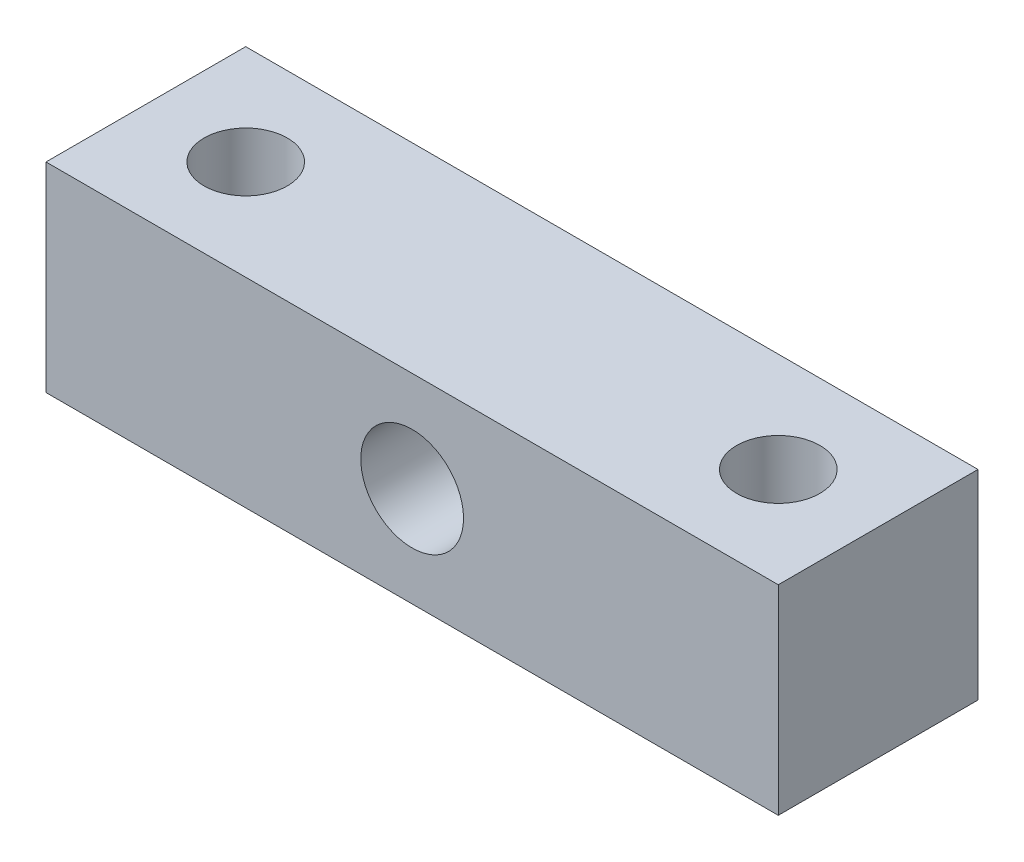
ISO-10303-21;
HEADER;
FILE_DESCRIPTION(('STEP AP214'),'2;1');
FILE_NAME('part.step','',(''),(''),'','','');
FILE_SCHEMA(('AUTOMOTIVE_DESIGN { 1 0 10303 214 1 1 1 1 }'));
ENDSEC;
DATA;
#1=APPLICATION_CONTEXT('core data for automotive mechanical design processes');
#2=APPLICATION_PROTOCOL_DEFINITION('international standard','automotive_design',2000,#1);
#3=PRODUCT_CONTEXT('',#1,'mechanical');
#4=PRODUCT('Part','Part','',(#3));
#5=PRODUCT_RELATED_PRODUCT_CATEGORY('part','',(#4));
#6=PRODUCT_DEFINITION_FORMATION('','',#4);
#7=PRODUCT_DEFINITION_CONTEXT('part definition',#1,'design');
#8=PRODUCT_DEFINITION('design','',#6,#7);
#9=PRODUCT_DEFINITION_SHAPE('','',#8);
#10=(LENGTH_UNIT() NAMED_UNIT(*) SI_UNIT(.MILLI.,.METRE.));
#11=(NAMED_UNIT(*) PLANE_ANGLE_UNIT() SI_UNIT($,.RADIAN.));
#12=(NAMED_UNIT(*) SI_UNIT($,.STERADIAN.) SOLID_ANGLE_UNIT());
#13=UNCERTAINTY_MEASURE_WITH_UNIT(LENGTH_MEASURE(1.E-05),#10,'distance_accuracy_value','');
#14=(GEOMETRIC_REPRESENTATION_CONTEXT(3) GLOBAL_UNCERTAINTY_ASSIGNED_CONTEXT((#13)) GLOBAL_UNIT_ASSIGNED_CONTEXT((#10,
#11,#12)) REPRESENTATION_CONTEXT('',''));
#15=CARTESIAN_POINT('',(0.,0.,0.));
#16=DIRECTION('',(0.,0.,1.));
#17=DIRECTION('',(1.,0.,0.));
#18=AXIS2_PLACEMENT_3D('',#15,#16,#17);
#19=CARTESIAN_POINT('',(34.925,-9.525,19.05));
#20=DIRECTION('',(-1.,0.,0.));
#21=DIRECTION('',(0.,0.,1.));
#22=AXIS2_PLACEMENT_3D('',#19,#20,#21);
#23=PLANE('',#22);
#24=DIRECTION('',(0.,1.,0.));
#25=VECTOR('',#24,1.);
#26=CARTESIAN_POINT('',(34.925,-9.525,0.));
#27=LINE('',#26,#25);
#28=CARTESIAN_POINT('',(34.925,-9.525,0.));
#29=VERTEX_POINT('',#28);
#30=CARTESIAN_POINT('',(34.925,9.525,0.));
#31=VERTEX_POINT('',#30);
#32=EDGE_CURVE('E98',#29,#31,#27,.T.);
#33=ORIENTED_EDGE('',*,*,#32,.T.);
#34=DIRECTION('',(0.,0.,-1.));
#35=VECTOR('',#34,1.);
#36=CARTESIAN_POINT('',(34.925,9.525,19.05));
#37=LINE('',#36,#35);
#38=CARTESIAN_POINT('',(34.925,9.525,19.05));
#39=VERTEX_POINT('',#38);
#40=EDGE_CURVE('E11',#39,#31,#37,.T.);
#41=ORIENTED_EDGE('',*,*,#40,.F.);
#42=DIRECTION('',(0.,1.,0.));
#43=VECTOR('',#42,1.);
#44=CARTESIAN_POINT('',(34.925,-9.525,19.05));
#45=LINE('',#44,#43);
#46=CARTESIAN_POINT('',(34.925,-9.525,19.05));
#47=VERTEX_POINT('',#46);
#48=EDGE_CURVE('E86',#47,#39,#45,.T.);
#49=ORIENTED_EDGE('',*,*,#48,.F.);
#50=DIRECTION('',(0.,0.,-1.));
#51=VECTOR('',#50,1.);
#52=CARTESIAN_POINT('',(34.925,-9.525,19.05));
#53=LINE('',#52,#51);
#54=EDGE_CURVE('E94',#47,#29,#53,.T.);
#55=ORIENTED_EDGE('',*,*,#54,.T.);
#56=EDGE_LOOP('',(#33,#41,#49,#55));
#57=FACE_BOUND('',#56,.T.);
#58=ADVANCED_FACE('F35',(#57),#23,.F.);
#59=CARTESIAN_POINT('',(-34.925,9.525,19.05));
#60=DIRECTION('',(0.,-1.,0.));
#61=DIRECTION('',(0.,0.,-1.));
#62=AXIS2_PLACEMENT_3D('',#59,#60,#61);
#63=PLANE('',#62);
#64=CARTESIAN_POINT('',(-25.4,9.525,9.525));
#65=DIRECTION('',(0.,1.,0.));
#66=DIRECTION('',(0.,0.,1.));
#67=AXIS2_PLACEMENT_3D('',#64,#65,#66);
#68=CIRCLE('',#67,3.96875);
#69=CARTESIAN_POINT('',(-25.4,9.525,13.49375));
#70=VERTEX_POINT('',#69);
#71=EDGE_CURVE('E126',#70,#70,#68,.T.);
#72=ORIENTED_EDGE('',*,*,#71,.F.);
#73=EDGE_LOOP('',(#72));
#74=FACE_BOUND('',#73,.T.);
#75=CARTESIAN_POINT('',(25.4,9.525,9.525));
#76=DIRECTION('',(0.,1.,0.));
#77=DIRECTION('',(0.,0.,1.));
#78=AXIS2_PLACEMENT_3D('',#75,#76,#77);
#79=CIRCLE('',#78,3.96875);
#80=CARTESIAN_POINT('',(25.4,9.525,13.49375));
#81=VERTEX_POINT('',#80);
#82=EDGE_CURVE('E120',#81,#81,#79,.T.);
#83=ORIENTED_EDGE('',*,*,#82,.F.);
#84=EDGE_LOOP('',(#83));
#85=FACE_BOUND('',#84,.T.);
#86=DIRECTION('',(-1.,0.,0.));
#87=VECTOR('',#86,1.);
#88=CARTESIAN_POINT('',(-34.925,9.525,0.));
#89=LINE('',#88,#87);
#90=CARTESIAN_POINT('',(-34.925,9.525,0.));
#91=VERTEX_POINT('',#90);
#92=EDGE_CURVE('E90',#31,#91,#89,.T.);
#93=ORIENTED_EDGE('',*,*,#92,.T.);
#94=DIRECTION('',(0.,0.,-1.));
#95=VECTOR('',#94,1.);
#96=CARTESIAN_POINT('',(-34.925,9.525,19.05));
#97=LINE('',#96,#95);
#98=CARTESIAN_POINT('',(-34.925,9.525,19.05));
#99=VERTEX_POINT('',#98);
#100=EDGE_CURVE('E43',#99,#91,#97,.T.);
#101=ORIENTED_EDGE('',*,*,#100,.F.);
#102=DIRECTION('',(-1.,0.,0.));
#103=VECTOR('',#102,1.);
#104=CARTESIAN_POINT('',(-34.925,9.525,19.05));
#105=LINE('',#104,#103);
#106=EDGE_CURVE('E81',#39,#99,#105,.T.);
#107=ORIENTED_EDGE('',*,*,#106,.F.);
#108=ORIENTED_EDGE('',*,*,#40,.T.);
#109=EDGE_LOOP('',(#93,#101,#107,#108));
#110=FACE_BOUND('',#109,.T.);
#111=ADVANCED_FACE('F89',(#74,#85,#110),#63,.F.);
#112=CARTESIAN_POINT('',(-34.925,-9.525,19.05));
#113=DIRECTION('',(1.,0.,0.));
#114=DIRECTION('',(0.,0.,-1.));
#115=AXIS2_PLACEMENT_3D('',#112,#113,#114);
#116=PLANE('',#115);
#117=DIRECTION('',(0.,-1.,0.));
#118=VECTOR('',#117,1.);
#119=CARTESIAN_POINT('',(-34.925,-9.525,0.));
#120=LINE('',#119,#118);
#121=CARTESIAN_POINT('',(-34.925,-9.525,0.));
#122=VERTEX_POINT('',#121);
#123=EDGE_CURVE('E68',#91,#122,#120,.T.);
#124=ORIENTED_EDGE('',*,*,#123,.T.);
#125=DIRECTION('',(0.,0.,-1.));
#126=VECTOR('',#125,1.);
#127=CARTESIAN_POINT('',(-34.925,-9.525,19.05));
#128=LINE('',#127,#126);
#129=CARTESIAN_POINT('',(-34.925,-9.525,19.05));
#130=VERTEX_POINT('',#129);
#131=EDGE_CURVE('E91',#130,#122,#128,.T.);
#132=ORIENTED_EDGE('',*,*,#131,.F.);
#133=DIRECTION('',(0.,-1.,0.));
#134=VECTOR('',#133,1.);
#135=CARTESIAN_POINT('',(-34.925,-9.525,19.05));
#136=LINE('',#135,#134);
#137=EDGE_CURVE('E84',#99,#130,#136,.T.);
#138=ORIENTED_EDGE('',*,*,#137,.F.);
#139=ORIENTED_EDGE('',*,*,#100,.T.);
#140=EDGE_LOOP('',(#124,#132,#138,#139));
#141=FACE_BOUND('',#140,.T.);
#142=ADVANCED_FACE('F92',(#141),#116,.F.);
#143=CARTESIAN_POINT('',(-34.925,-9.525,19.05));
#144=DIRECTION('',(0.,1.,0.));
#145=DIRECTION('',(0.,0.,1.));
#146=AXIS2_PLACEMENT_3D('',#143,#144,#145);
#147=PLANE('',#146);
#148=CARTESIAN_POINT('',(-25.4,-9.525,9.525));
#149=DIRECTION('',(0.,1.,0.));
#150=DIRECTION('',(0.,0.,1.));
#151=AXIS2_PLACEMENT_3D('',#148,#149,#150);
#152=CIRCLE('',#151,3.96874999999999);
#153=CARTESIAN_POINT('',(-25.4,-9.525,13.49375));
#154=VERTEX_POINT('',#153);
#155=EDGE_CURVE('E123',#154,#154,#152,.T.);
#156=ORIENTED_EDGE('',*,*,#155,.T.);
#157=EDGE_LOOP('',(#156));
#158=FACE_BOUND('',#157,.T.);
#159=CARTESIAN_POINT('',(25.4,-9.525,9.525));
#160=DIRECTION('',(0.,1.,0.));
#161=DIRECTION('',(0.,0.,1.));
#162=AXIS2_PLACEMENT_3D('',#159,#160,#161);
#163=CIRCLE('',#162,3.96874999999999);
#164=CARTESIAN_POINT('',(25.4,-9.525,13.49375));
#165=VERTEX_POINT('',#164);
#166=EDGE_CURVE('E117',#165,#165,#163,.T.);
#167=ORIENTED_EDGE('',*,*,#166,.T.);
#168=EDGE_LOOP('',(#167));
#169=FACE_BOUND('',#168,.T.);
#170=DIRECTION('',(1.,0.,0.));
#171=VECTOR('',#170,1.);
#172=CARTESIAN_POINT('',(-34.925,-9.525,0.));
#173=LINE('',#172,#171);
#174=EDGE_CURVE('E74',#122,#29,#173,.T.);
#175=ORIENTED_EDGE('',*,*,#174,.T.);
#176=ORIENTED_EDGE('',*,*,#54,.F.);
#177=DIRECTION('',(1.,0.,0.));
#178=VECTOR('',#177,1.);
#179=CARTESIAN_POINT('',(-34.925,-9.525,19.05));
#180=LINE('',#179,#178);
#181=EDGE_CURVE('E51',#130,#47,#180,.T.);
#182=ORIENTED_EDGE('',*,*,#181,.F.);
#183=ORIENTED_EDGE('',*,*,#131,.T.);
#184=EDGE_LOOP('',(#175,#176,#182,#183));
#185=FACE_BOUND('',#184,.T.);
#186=ADVANCED_FACE('F106',(#158,#169,#185),#147,.F.);
#187=CARTESIAN_POINT('',(0.,0.,19.05));
#188=DIRECTION('',(0.,0.,-1.));
#189=DIRECTION('',(-1.,0.,0.));
#190=AXIS2_PLACEMENT_3D('',#187,#188,#189);
#191=PLANE('',#190);
#192=CARTESIAN_POINT('',(0.,0.,19.05));
#193=DIRECTION('',(0.,0.,1.));
#194=DIRECTION('',(1.,0.,0.));
#195=AXIS2_PLACEMENT_3D('',#192,#193,#194);
#196=CIRCLE('',#195,4.9022);
#197=CARTESIAN_POINT('',(4.9022,0.,19.05));
#198=VERTEX_POINT('',#197);
#199=EDGE_CURVE('E114',#198,#198,#196,.T.);
#200=ORIENTED_EDGE('',*,*,#199,.F.);
#201=EDGE_LOOP('',(#200));
#202=FACE_BOUND('',#201,.T.);
#203=ORIENTED_EDGE('',*,*,#48,.T.);
#204=ORIENTED_EDGE('',*,*,#106,.T.);
#205=ORIENTED_EDGE('',*,*,#137,.T.);
#206=ORIENTED_EDGE('',*,*,#181,.T.);
#207=EDGE_LOOP('',(#203,#204,#205,#206));
#208=FACE_BOUND('',#207,.T.);
#209=ADVANCED_FACE('F82',(#202,#208),#191,.F.);
#210=CARTESIAN_POINT('',(0.,0.,0.));
#211=DIRECTION('',(0.,0.,-1.));
#212=DIRECTION('',(-1.,0.,0.));
#213=AXIS2_PLACEMENT_3D('',#210,#211,#212);
#214=PLANE('',#213);
#215=CARTESIAN_POINT('',(0.,0.,0.));
#216=DIRECTION('',(0.,0.,1.));
#217=DIRECTION('',(1.,0.,0.));
#218=AXIS2_PLACEMENT_3D('',#215,#216,#217);
#219=CIRCLE('',#218,4.90219999999999);
#220=CARTESIAN_POINT('',(4.90219999999999,0.,0.));
#221=VERTEX_POINT('',#220);
#222=EDGE_CURVE('E101',#221,#221,#219,.T.);
#223=ORIENTED_EDGE('',*,*,#222,.T.);
#224=EDGE_LOOP('',(#223));
#225=FACE_BOUND('',#224,.T.);
#226=ORIENTED_EDGE('',*,*,#32,.F.);
#227=ORIENTED_EDGE('',*,*,#174,.F.);
#228=ORIENTED_EDGE('',*,*,#123,.F.);
#229=ORIENTED_EDGE('',*,*,#92,.F.);
#230=EDGE_LOOP('',(#226,#227,#228,#229));
#231=FACE_BOUND('',#230,.T.);
#232=ADVANCED_FACE('F109',(#225,#231),#214,.T.);
#233=CARTESIAN_POINT('',(0.,0.,19.05));
#234=DIRECTION('',(0.,0.,1.));
#235=DIRECTION('',(1.,0.,0.));
#236=AXIS2_PLACEMENT_3D('',#233,#234,#235);
#237=CYLINDRICAL_SURFACE('',#236,4.9022);
#238=ORIENTED_EDGE('',*,*,#222,.F.);
#239=EDGE_LOOP('',(#238));
#240=FACE_BOUND('',#239,.T.);
#241=ORIENTED_EDGE('',*,*,#199,.T.);
#242=EDGE_LOOP('',(#241));
#243=FACE_BOUND('',#242,.T.);
#244=ADVANCED_FACE('F138',(#240,#243),#237,.F.);
#245=CARTESIAN_POINT('',(25.4,9.525,9.525));
#246=DIRECTION('',(0.,1.,0.));
#247=DIRECTION('',(0.,0.,1.));
#248=AXIS2_PLACEMENT_3D('',#245,#246,#247);
#249=CYLINDRICAL_SURFACE('',#248,3.96875);
#250=ORIENTED_EDGE('',*,*,#166,.F.);
#251=EDGE_LOOP('',(#250));
#252=FACE_BOUND('',#251,.T.);
#253=ORIENTED_EDGE('',*,*,#82,.T.);
#254=EDGE_LOOP('',(#253));
#255=FACE_BOUND('',#254,.T.);
#256=ADVANCED_FACE('F136',(#252,#255),#249,.F.);
#257=CARTESIAN_POINT('',(-25.4,9.525,9.525));
#258=DIRECTION('',(0.,1.,0.));
#259=DIRECTION('',(0.,0.,1.));
#260=AXIS2_PLACEMENT_3D('',#257,#258,#259);
#261=CYLINDRICAL_SURFACE('',#260,3.96875);
#262=ORIENTED_EDGE('',*,*,#155,.F.);
#263=EDGE_LOOP('',(#262));
#264=FACE_BOUND('',#263,.T.);
#265=ORIENTED_EDGE('',*,*,#71,.T.);
#266=EDGE_LOOP('',(#265));
#267=FACE_BOUND('',#266,.T.);
#268=ADVANCED_FACE('F130',(#264,#267),#261,.F.);
#269=CLOSED_SHELL('',(#58,#111,#142,#186,#209,#232,#244,#256,#268));
#270=MANIFOLD_SOLID_BREP('B2',#269);
#271=ADVANCED_BREP_SHAPE_REPRESENTATION('',(#18,#270),#14);
#272=SHAPE_DEFINITION_REPRESENTATION(#9,#271);
ENDSEC;
END-ISO-10303-21;
